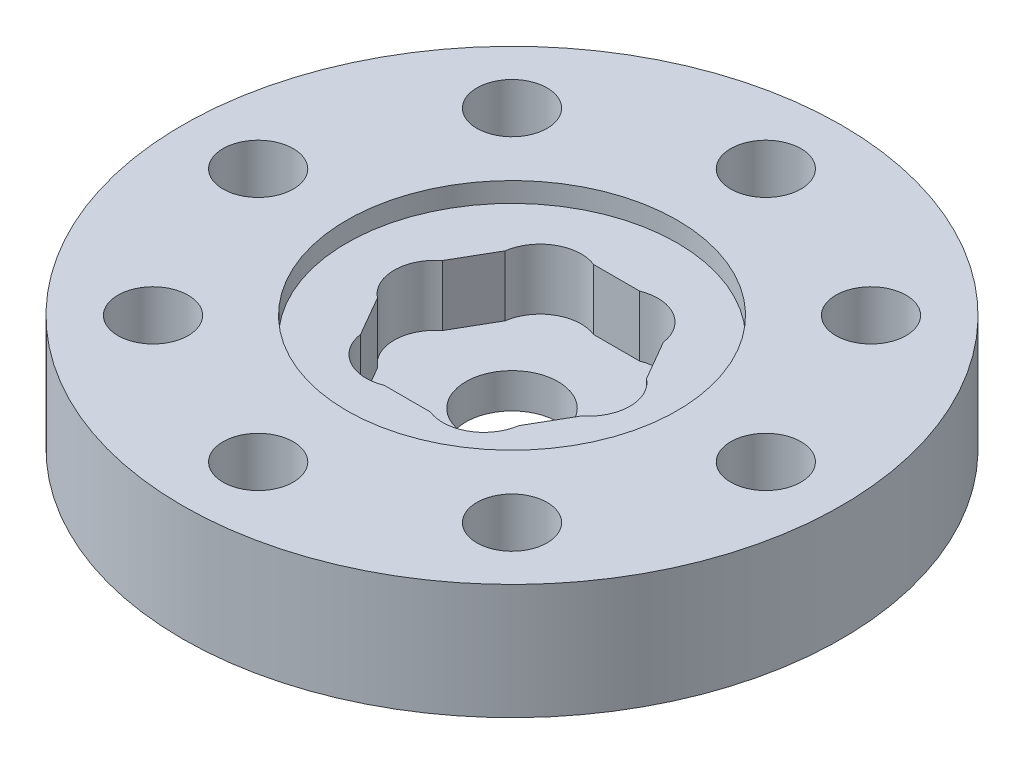
ISO-10303-21;
HEADER;
FILE_DESCRIPTION(('STEP AP214'),'2;1');
FILE_NAME('part.step','',(''),(''),'','','');
FILE_SCHEMA(('AUTOMOTIVE_DESIGN { 1 0 10303 214 1 1 1 1 }'));
ENDSEC;
DATA;
#1=APPLICATION_CONTEXT('core data for automotive mechanical design processes');
#2=APPLICATION_PROTOCOL_DEFINITION('international standard','automotive_design',2000,#1);
#3=PRODUCT_CONTEXT('',#1,'mechanical');
#4=PRODUCT('Part','Part','',(#3));
#5=PRODUCT_RELATED_PRODUCT_CATEGORY('part','',(#4));
#6=PRODUCT_DEFINITION_FORMATION('','',#4);
#7=PRODUCT_DEFINITION_CONTEXT('part definition',#1,'design');
#8=PRODUCT_DEFINITION('design','',#6,#7);
#9=PRODUCT_DEFINITION_SHAPE('','',#8);
#10=(LENGTH_UNIT() NAMED_UNIT(*) SI_UNIT(.MILLI.,.METRE.));
#11=(NAMED_UNIT(*) PLANE_ANGLE_UNIT() SI_UNIT($,.RADIAN.));
#12=(NAMED_UNIT(*) SI_UNIT($,.STERADIAN.) SOLID_ANGLE_UNIT());
#13=UNCERTAINTY_MEASURE_WITH_UNIT(LENGTH_MEASURE(1.E-05),#10,'distance_accuracy_value','');
#14=(GEOMETRIC_REPRESENTATION_CONTEXT(3) GLOBAL_UNCERTAINTY_ASSIGNED_CONTEXT((#13)) GLOBAL_UNIT_ASSIGNED_CONTEXT((#10,
#11,#12)) REPRESENTATION_CONTEXT('',''));
#15=CARTESIAN_POINT('',(0.,0.,0.));
#16=DIRECTION('',(0.,0.,1.));
#17=DIRECTION('',(1.,0.,0.));
#18=AXIS2_PLACEMENT_3D('',#15,#16,#17);
#19=CARTESIAN_POINT('',(0.,0.,0.));
#20=DIRECTION('',(0.,1.,0.));
#21=DIRECTION('',(0.,0.,1.));
#22=AXIS2_PLACEMENT_3D('',#19,#20,#21);
#23=PLANE('',#22);
#24=CARTESIAN_POINT('',(0.,5.21913241791072E-11,0.));
#25=DIRECTION('',(0.,1.,0.));
#26=DIRECTION('',(0.,0.,1.));
#27=AXIS2_PLACEMENT_3D('',#24,#25,#26);
#28=CIRCLE('',#27,4.12749999998141);
#29=CARTESIAN_POINT('',(0.,5.21913241791072E-11,4.12749999998141));
#30=VERTEX_POINT('',#29);
#31=EDGE_CURVE('E269',#30,#30,#28,.T.);
#32=ORIENTED_EDGE('',*,*,#31,.F.);
#33=EDGE_LOOP('',(#32));
#34=FACE_BOUND('',#33,.T.);
#35=CARTESIAN_POINT('',(0.,0.,0.));
#36=DIRECTION('',(0.,1.,0.));
#37=DIRECTION('',(0.,0.,1.));
#38=AXIS2_PLACEMENT_3D('',#35,#36,#37);
#39=CIRCLE('',#38,1.77799999999999);
#40=CARTESIAN_POINT('',(0.,0.,1.77799999999999));
#41=VERTEX_POINT('',#40);
#42=EDGE_CURVE('E19',#41,#41,#39,.T.);
#43=ORIENTED_EDGE('',*,*,#42,.T.);
#44=EDGE_LOOP('',(#43));
#45=FACE_BOUND('',#44,.T.);
#46=ADVANCED_FACE('F16',(#34,#45),#23,.F.);
#47=CARTESIAN_POINT('',(0.,1.3462,0.));
#48=DIRECTION('',(0.,1.,0.));
#49=DIRECTION('',(0.,0.,1.));
#50=AXIS2_PLACEMENT_3D('',#47,#48,#49);
#51=CYLINDRICAL_SURFACE('',#50,1.77799999999999);
#52=CARTESIAN_POINT('',(0.,1.3462,0.));
#53=DIRECTION('',(0.,1.,0.));
#54=DIRECTION('',(0.,0.,1.));
#55=AXIS2_PLACEMENT_3D('',#52,#53,#54);
#56=CIRCLE('',#55,1.77799999999999);
#57=CARTESIAN_POINT('',(0.,1.3462,1.77799999999999));
#58=VERTEX_POINT('',#57);
#59=EDGE_CURVE('E267',#58,#58,#56,.F.);
#60=ORIENTED_EDGE('',*,*,#59,.F.);
#61=EDGE_LOOP('',(#60));
#62=FACE_BOUND('',#61,.T.);
#63=ORIENTED_EDGE('',*,*,#42,.F.);
#64=EDGE_LOOP('',(#63));
#65=FACE_BOUND('',#64,.T.);
#66=ADVANCED_FACE('F277',(#62,#65),#51,.F.);
#67=CARTESIAN_POINT('',(0.,1.21919999997999,0.));
#68=DIRECTION('',(0.,1.,0.));
#69=DIRECTION('',(0.,0.,1.));
#70=AXIS2_PLACEMENT_3D('',#67,#68,#69);
#71=CONICAL_SURFACE('',#70,5.39871959597349,0.806283010546046);
#72=ORIENTED_EDGE('',*,*,#31,.T.);
#73=EDGE_LOOP('',(#72));
#74=FACE_BOUND('',#73,.T.);
#75=CARTESIAN_POINT('',(0.,1.21920000008903,0.));
#76=DIRECTION('',(0.,1.,0.));
#77=DIRECTION('',(0.,0.,1.));
#78=AXIS2_PLACEMENT_3D('',#75,#76,#77);
#79=CIRCLE('',#78,5.39871959608718);
#80=CARTESIAN_POINT('',(0.,1.21920000008903,5.39871959608718));
#81=VERTEX_POINT('',#80);
#82=EDGE_CURVE('E183',#81,#81,#79,.T.);
#83=ORIENTED_EDGE('',*,*,#82,.F.);
#84=EDGE_LOOP('',(#83));
#85=FACE_BOUND('',#84,.T.);
#86=ADVANCED_FACE('F279',(#74,#85),#71,.T.);
#87=CARTESIAN_POINT('',(0.,1.3462,0.));
#88=DIRECTION('',(0.,1.,0.));
#89=DIRECTION('',(0.,0.,1.));
#90=AXIS2_PLACEMENT_3D('',#87,#88,#89);
#91=PLANE('',#90);
#92=DIRECTION('',(-0.5,0.,-0.866025403784439));
#93=VECTOR('',#92,1.);
#94=CARTESIAN_POINT('',(3.4920309344098,1.3462,-2.016125));
#95=LINE('',#94,#93);
#96=CARTESIAN_POINT('',(3.93473684008889,1.3462,-1.24933587855304));
#97=VERTEX_POINT('',#96);
#98=CARTESIAN_POINT('',(3.04932502873073,1.3462,-2.78291412144695));
#99=VERTEX_POINT('',#98);
#100=EDGE_CURVE('E176',#97,#99,#95,.T.);
#101=ORIENTED_EDGE('',*,*,#100,.T.);
#102=CARTESIAN_POINT('',(1.477645,1.3462,-2.55935621555012));
#103=DIRECTION('',(0.,1.,0.));
#104=DIRECTION('',(0.,0.,1.));
#105=AXIS2_PLACEMENT_3D('',#102,#103,#104);
#106=CIRCLE('',#105,1.5875);
#107=CARTESIAN_POINT('',(0.885411811358147,1.3462,-4.03225));
#108=VERTEX_POINT('',#107);
#109=EDGE_CURVE('E179',#99,#108,#106,.T.);
#110=ORIENTED_EDGE('',*,*,#109,.T.);
#111=DIRECTION('',(-1.,0.,0.));
#112=VECTOR('',#111,1.);
#113=CARTESIAN_POINT('',(0.,1.3462,-4.03225));
#114=LINE('',#113,#112);
#115=CARTESIAN_POINT('',(-0.885411811358071,1.3462,-4.03225));
#116=VERTEX_POINT('',#115);
#117=EDGE_CURVE('E181',#108,#116,#114,.T.);
#118=ORIENTED_EDGE('',*,*,#117,.T.);
#119=CARTESIAN_POINT('',(-1.47764499999997,1.3462,-2.55935621555013));
#120=DIRECTION('',(0.,1.,0.));
#121=DIRECTION('',(0.,0.,1.));
#122=AXIS2_PLACEMENT_3D('',#119,#120,#121);
#123=CIRCLE('',#122,1.5875);
#124=CARTESIAN_POINT('',(-3.04932502873069,1.3462,-2.78291412144701));
#125=VERTEX_POINT('',#124);
#126=EDGE_CURVE('E152',#116,#125,#123,.T.);
#127=ORIENTED_EDGE('',*,*,#126,.T.);
#128=DIRECTION('',(-0.5,0.,0.866025403784439));
#129=VECTOR('',#128,1.);
#130=CARTESIAN_POINT('',(-3.4920309344098,1.3462,-2.016125));
#131=LINE('',#130,#129);
#132=CARTESIAN_POINT('',(-3.93473684008885,1.3462,-1.2493358785531));
#133=VERTEX_POINT('',#132);
#134=EDGE_CURVE('E158',#125,#133,#131,.T.);
#135=ORIENTED_EDGE('',*,*,#134,.T.);
#136=CARTESIAN_POINT('',(-2.95529,1.3462,0.));
#137=DIRECTION('',(0.,1.,0.));
#138=DIRECTION('',(0.,0.,1.));
#139=AXIS2_PLACEMENT_3D('',#136,#137,#138);
#140=CIRCLE('',#139,1.5875);
#141=CARTESIAN_POINT('',(-3.9347368400889,1.3462,1.249335878553));
#142=VERTEX_POINT('',#141);
#143=EDGE_CURVE('E161',#133,#142,#140,.T.);
#144=ORIENTED_EDGE('',*,*,#143,.T.);
#145=DIRECTION('',(0.500000000000001,0.,0.866025403784438));
#146=VECTOR('',#145,1.);
#147=CARTESIAN_POINT('',(-3.4920309344098,1.3462,2.016125));
#148=LINE('',#147,#146);
#149=CARTESIAN_POINT('',(-3.04932502873075,1.3462,2.78291412144691));
#150=VERTEX_POINT('',#149);
#151=EDGE_CURVE('E163',#142,#150,#148,.T.);
#152=ORIENTED_EDGE('',*,*,#151,.T.);
#153=CARTESIAN_POINT('',(-1.47764500000002,1.3462,2.55935621555011));
#154=DIRECTION('',(0.,1.,0.));
#155=DIRECTION('',(0.,0.,1.));
#156=AXIS2_PLACEMENT_3D('',#153,#154,#155);
#157=CIRCLE('',#156,1.5875);
#158=CARTESIAN_POINT('',(-0.885411811358191,1.3462,4.03225));
#159=VERTEX_POINT('',#158);
#160=EDGE_CURVE('E130',#150,#159,#157,.T.);
#161=ORIENTED_EDGE('',*,*,#160,.T.);
#162=DIRECTION('',(1.,0.,0.));
#163=VECTOR('',#162,1.);
#164=CARTESIAN_POINT('',(0.,1.3462,4.03225));
#165=LINE('',#164,#163);
#166=CARTESIAN_POINT('',(0.88541181135812,1.3462,4.03225));
#167=VERTEX_POINT('',#166);
#168=EDGE_CURVE('E131',#159,#167,#165,.T.);
#169=ORIENTED_EDGE('',*,*,#168,.T.);
#170=CARTESIAN_POINT('',(1.47764499999999,1.3462,2.55935621555012));
#171=DIRECTION('',(0.,1.,0.));
#172=DIRECTION('',(0.,0.,1.));
#173=AXIS2_PLACEMENT_3D('',#170,#171,#172);
#174=CIRCLE('',#173,1.5875);
#175=CARTESIAN_POINT('',(3.04932502873072,1.3462,2.78291412144697));
#176=VERTEX_POINT('',#175);
#177=EDGE_CURVE('E126',#167,#176,#174,.T.);
#178=ORIENTED_EDGE('',*,*,#177,.T.);
#179=DIRECTION('',(0.5,0.,-0.866025403784439));
#180=VECTOR('',#179,1.);
#181=CARTESIAN_POINT('',(3.4920309344098,1.3462,2.016125));
#182=LINE('',#181,#180);
#183=CARTESIAN_POINT('',(3.93473684008887,1.3462,1.24933587855306));
#184=VERTEX_POINT('',#183);
#185=EDGE_CURVE('E170',#176,#184,#182,.T.);
#186=ORIENTED_EDGE('',*,*,#185,.T.);
#187=CARTESIAN_POINT('',(2.95529,1.3462,0.));
#188=DIRECTION('',(0.,1.,0.));
#189=DIRECTION('',(0.,0.,1.));
#190=AXIS2_PLACEMENT_3D('',#187,#188,#189);
#191=CIRCLE('',#190,1.5875);
#192=EDGE_CURVE('E173',#184,#97,#191,.T.);
#193=ORIENTED_EDGE('',*,*,#192,.T.);
#194=EDGE_LOOP('',(#101,#110,#118,#127,#135,#144,#152,#161,#169,#178,#186,#193));
#195=FACE_BOUND('',#194,.T.);
#196=ORIENTED_EDGE('',*,*,#59,.T.);
#197=EDGE_LOOP('',(#196));
#198=FACE_BOUND('',#197,.T.);
#199=ADVANCED_FACE('F286',(#195,#198),#91,.T.);
#200=CARTESIAN_POINT('',(0.,1.2192,0.));
#201=DIRECTION('',(0.,-1.,0.));
#202=DIRECTION('',(0.,0.,-1.));
#203=AXIS2_PLACEMENT_3D('',#200,#201,#202);
#204=PLANE('',#203);
#205=CARTESIAN_POINT('',(0.,1.2192,0.));
#206=DIRECTION('',(0.,-1.,0.));
#207=DIRECTION('',(0.,0.,-1.));
#208=AXIS2_PLACEMENT_3D('',#205,#206,#207);
#209=CIRCLE('',#208,6.67517040391699);
#210=CARTESIAN_POINT('',(0.,1.2192,-6.67517040391699));
#211=VERTEX_POINT('',#210);
#212=EDGE_CURVE('E150',#211,#211,#209,.T.);
#213=ORIENTED_EDGE('',*,*,#212,.T.);
#214=EDGE_LOOP('',(#213));
#215=FACE_BOUND('',#214,.T.);
#216=ORIENTED_EDGE('',*,*,#82,.T.);
#217=EDGE_LOOP('',(#216));
#218=FACE_BOUND('',#217,.T.);
#219=ADVANCED_FACE('F390',(#215,#218),#204,.T.);
#220=CARTESIAN_POINT('',(0.,1.3462,-4.03225));
#221=DIRECTION('',(0.,0.,-1.));
#222=DIRECTION('',(-1.,0.,0.));
#223=AXIS2_PLACEMENT_3D('',#220,#221,#222);
#224=PLANE('',#223);
#225=DIRECTION('',(0.,1.,0.));
#226=VECTOR('',#225,1.);
#227=CARTESIAN_POINT('',(-0.885411811358071,1.3462,-4.03225));
#228=LINE('',#227,#226);
#229=CARTESIAN_POINT('',(-0.885411811358071,3.683,-4.03225));
#230=VERTEX_POINT('',#229);
#231=EDGE_CURVE('E153',#230,#116,#228,.F.);
#232=ORIENTED_EDGE('',*,*,#231,.T.);
#233=ORIENTED_EDGE('',*,*,#117,.F.);
#234=DIRECTION('',(0.,1.,0.));
#235=VECTOR('',#234,1.);
#236=CARTESIAN_POINT('',(0.885411811358147,1.3462,-4.03225));
#237=LINE('',#236,#235);
#238=CARTESIAN_POINT('',(0.885411811358147,3.683,-4.03225));
#239=VERTEX_POINT('',#238);
#240=EDGE_CURVE('E177',#108,#239,#237,.T.);
#241=ORIENTED_EDGE('',*,*,#240,.T.);
#242=DIRECTION('',(1.,0.,0.));
#243=VECTOR('',#242,1.);
#244=CARTESIAN_POINT('',(0.,3.683,-4.03225));
#245=LINE('',#244,#243);
#246=EDGE_CURVE('E147',#230,#239,#245,.T.);
#247=ORIENTED_EDGE('',*,*,#246,.F.);
#248=EDGE_LOOP('',(#232,#233,#241,#247));
#249=FACE_BOUND('',#248,.T.);
#250=ADVANCED_FACE('F386',(#249),#224,.F.);
#251=CARTESIAN_POINT('',(1.477645,1.3462,-2.55935621555012));
#252=DIRECTION('',(0.,1.,0.));
#253=DIRECTION('',(0.,0.,1.));
#254=AXIS2_PLACEMENT_3D('',#251,#252,#253);
#255=CYLINDRICAL_SURFACE('',#254,1.5875);
#256=ORIENTED_EDGE('',*,*,#240,.F.);
#257=ORIENTED_EDGE('',*,*,#109,.F.);
#258=DIRECTION('',(0.,1.,0.));
#259=VECTOR('',#258,1.);
#260=CARTESIAN_POINT('',(3.04932502873073,1.3462,-2.78291412144695));
#261=LINE('',#260,#259);
#262=CARTESIAN_POINT('',(3.04932502873073,3.683,-2.78291412144695));
#263=VERTEX_POINT('',#262);
#264=EDGE_CURVE('E174',#99,#263,#261,.T.);
#265=ORIENTED_EDGE('',*,*,#264,.T.);
#266=CARTESIAN_POINT('',(1.477645,3.683,-2.55935621555012));
#267=DIRECTION('',(0.,1.,0.));
#268=DIRECTION('',(0.,0.,1.));
#269=AXIS2_PLACEMENT_3D('',#266,#267,#268);
#270=CIRCLE('',#269,1.5875);
#271=EDGE_CURVE('E146',#239,#263,#270,.F.);
#272=ORIENTED_EDGE('',*,*,#271,.F.);
#273=EDGE_LOOP('',(#256,#257,#265,#272));
#274=FACE_BOUND('',#273,.T.);
#275=ADVANCED_FACE('F382',(#274),#255,.F.);
#276=CARTESIAN_POINT('',(3.4920309344098,1.3462,-2.016125));
#277=DIRECTION('',(0.866025403784439,0.,-0.5));
#278=DIRECTION('',(-0.5,0.,-0.866025403784439));
#279=AXIS2_PLACEMENT_3D('',#276,#277,#278);
#280=PLANE('',#279);
#281=ORIENTED_EDGE('',*,*,#264,.F.);
#282=ORIENTED_EDGE('',*,*,#100,.F.);
#283=DIRECTION('',(0.,1.,0.));
#284=VECTOR('',#283,1.);
#285=CARTESIAN_POINT('',(3.93473684008889,1.3462,-1.24933587855304));
#286=LINE('',#285,#284);
#287=CARTESIAN_POINT('',(3.93473684008889,3.683,-1.24933587855304));
#288=VERTEX_POINT('',#287);
#289=EDGE_CURVE('E171',#97,#288,#286,.T.);
#290=ORIENTED_EDGE('',*,*,#289,.T.);
#291=DIRECTION('',(0.5,0.,0.866025403784438));
#292=VECTOR('',#291,1.);
#293=CARTESIAN_POINT('',(3.04932502873073,3.683,-2.78291412144695));
#294=LINE('',#293,#292);
#295=EDGE_CURVE('E143',#263,#288,#294,.T.);
#296=ORIENTED_EDGE('',*,*,#295,.F.);
#297=EDGE_LOOP('',(#281,#282,#290,#296));
#298=FACE_BOUND('',#297,.T.);
#299=ADVANCED_FACE('F378',(#298),#280,.F.);
#300=CARTESIAN_POINT('',(2.95529,1.3462,0.));
#301=DIRECTION('',(0.,1.,0.));
#302=DIRECTION('',(0.,0.,1.));
#303=AXIS2_PLACEMENT_3D('',#300,#301,#302);
#304=CYLINDRICAL_SURFACE('',#303,1.5875);
#305=ORIENTED_EDGE('',*,*,#289,.F.);
#306=ORIENTED_EDGE('',*,*,#192,.F.);
#307=DIRECTION('',(0.,1.,0.));
#308=VECTOR('',#307,1.);
#309=CARTESIAN_POINT('',(3.93473684008887,1.3462,1.24933587855306));
#310=LINE('',#309,#308);
#311=CARTESIAN_POINT('',(3.93473684008887,3.683,1.24933587855306));
#312=VERTEX_POINT('',#311);
#313=EDGE_CURVE('E168',#184,#312,#310,.T.);
#314=ORIENTED_EDGE('',*,*,#313,.T.);
#315=CARTESIAN_POINT('',(2.95529,3.683,0.));
#316=DIRECTION('',(0.,1.,0.));
#317=DIRECTION('',(0.,0.,1.));
#318=AXIS2_PLACEMENT_3D('',#315,#316,#317);
#319=CIRCLE('',#318,1.5875);
#320=EDGE_CURVE('E142',#288,#312,#319,.F.);
#321=ORIENTED_EDGE('',*,*,#320,.F.);
#322=EDGE_LOOP('',(#305,#306,#314,#321));
#323=FACE_BOUND('',#322,.T.);
#324=ADVANCED_FACE('F374',(#323),#304,.F.);
#325=CARTESIAN_POINT('',(3.4920309344098,1.3462,2.016125));
#326=DIRECTION('',(0.866025403784439,0.,0.5));
#327=DIRECTION('',(0.5,0.,-0.866025403784439));
#328=AXIS2_PLACEMENT_3D('',#325,#326,#327);
#329=PLANE('',#328);
#330=ORIENTED_EDGE('',*,*,#313,.F.);
#331=ORIENTED_EDGE('',*,*,#185,.F.);
#332=DIRECTION('',(0.,1.,0.));
#333=VECTOR('',#332,1.);
#334=CARTESIAN_POINT('',(3.04932502873072,1.3462,2.78291412144697));
#335=LINE('',#334,#333);
#336=CARTESIAN_POINT('',(3.04932502873072,3.683,2.78291412144697));
#337=VERTEX_POINT('',#336);
#338=EDGE_CURVE('E166',#176,#337,#335,.T.);
#339=ORIENTED_EDGE('',*,*,#338,.T.);
#340=DIRECTION('',(-0.5,0.,0.866025403784439));
#341=VECTOR('',#340,1.);
#342=CARTESIAN_POINT('',(3.93473684008887,3.683,1.24933587855306));
#343=LINE('',#342,#341);
#344=EDGE_CURVE('E118',#312,#337,#343,.T.);
#345=ORIENTED_EDGE('',*,*,#344,.F.);
#346=EDGE_LOOP('',(#330,#331,#339,#345));
#347=FACE_BOUND('',#346,.T.);
#348=ADVANCED_FACE('F371',(#347),#329,.F.);
#349=CARTESIAN_POINT('',(1.47764499999999,1.3462,2.55935621555012));
#350=DIRECTION('',(0.,1.,0.));
#351=DIRECTION('',(0.,0.,1.));
#352=AXIS2_PLACEMENT_3D('',#349,#350,#351);
#353=CYLINDRICAL_SURFACE('',#352,1.5875);
#354=ORIENTED_EDGE('',*,*,#177,.F.);
#355=DIRECTION('',(0.,1.,0.));
#356=VECTOR('',#355,1.);
#357=CARTESIAN_POINT('',(0.88541181135812,1.3462,4.03225));
#358=LINE('',#357,#356);
#359=CARTESIAN_POINT('',(0.885411811358121,3.683,4.03225));
#360=VERTEX_POINT('',#359);
#361=EDGE_CURVE('E123',#167,#360,#358,.T.);
#362=ORIENTED_EDGE('',*,*,#361,.T.);
#363=CARTESIAN_POINT('',(1.47764499999999,3.683,2.55935621555012));
#364=DIRECTION('',(0.,1.,0.));
#365=DIRECTION('',(0.,0.,1.));
#366=AXIS2_PLACEMENT_3D('',#363,#364,#365);
#367=CIRCLE('',#366,1.5875);
#368=EDGE_CURVE('E110',#337,#360,#367,.F.);
#369=ORIENTED_EDGE('',*,*,#368,.F.);
#370=ORIENTED_EDGE('',*,*,#338,.F.);
#371=EDGE_LOOP('',(#354,#362,#369,#370));
#372=FACE_BOUND('',#371,.T.);
#373=ADVANCED_FACE('F124',(#372),#353,.F.);
#374=CARTESIAN_POINT('',(0.,1.3462,4.03225));
#375=DIRECTION('',(0.,0.,1.));
#376=DIRECTION('',(1.,0.,0.));
#377=AXIS2_PLACEMENT_3D('',#374,#375,#376);
#378=PLANE('',#377);
#379=ORIENTED_EDGE('',*,*,#361,.F.);
#380=ORIENTED_EDGE('',*,*,#168,.F.);
#381=DIRECTION('',(0.,1.,0.));
#382=VECTOR('',#381,1.);
#383=CARTESIAN_POINT('',(-0.885411811358191,1.3462,4.03225));
#384=LINE('',#383,#382);
#385=CARTESIAN_POINT('',(-0.885411811358191,3.683,4.03225));
#386=VERTEX_POINT('',#385);
#387=EDGE_CURVE('E134',#386,#159,#384,.F.);
#388=ORIENTED_EDGE('',*,*,#387,.F.);
#389=DIRECTION('',(1.,0.,0.));
#390=VECTOR('',#389,1.);
#391=CARTESIAN_POINT('',(0.,3.683,4.03225));
#392=LINE('',#391,#390);
#393=EDGE_CURVE('E115',#360,#386,#392,.F.);
#394=ORIENTED_EDGE('',*,*,#393,.F.);
#395=EDGE_LOOP('',(#379,#380,#388,#394));
#396=FACE_BOUND('',#395,.T.);
#397=ADVANCED_FACE('F133',(#396),#378,.F.);
#398=CARTESIAN_POINT('',(-1.47764500000002,1.3462,2.55935621555011));
#399=DIRECTION('',(0.,1.,0.));
#400=DIRECTION('',(0.,0.,1.));
#401=AXIS2_PLACEMENT_3D('',#398,#399,#400);
#402=CYLINDRICAL_SURFACE('',#401,1.5875);
#403=ORIENTED_EDGE('',*,*,#160,.F.);
#404=DIRECTION('',(0.,1.,0.));
#405=VECTOR('',#404,1.);
#406=CARTESIAN_POINT('',(-3.04932502873075,1.3462,2.78291412144691));
#407=LINE('',#406,#405);
#408=CARTESIAN_POINT('',(-3.04932502873075,3.683,2.78291412144691));
#409=VERTEX_POINT('',#408);
#410=EDGE_CURVE('E162',#150,#409,#407,.T.);
#411=ORIENTED_EDGE('',*,*,#410,.T.);
#412=CARTESIAN_POINT('',(-1.47764500000002,3.683,2.55935621555011));
#413=DIRECTION('',(0.,1.,0.));
#414=DIRECTION('',(0.,0.,1.));
#415=AXIS2_PLACEMENT_3D('',#412,#413,#414);
#416=CIRCLE('',#415,1.5875);
#417=EDGE_CURVE('E103',#386,#409,#416,.F.);
#418=ORIENTED_EDGE('',*,*,#417,.F.);
#419=ORIENTED_EDGE('',*,*,#387,.T.);
#420=EDGE_LOOP('',(#403,#411,#418,#419));
#421=FACE_BOUND('',#420,.T.);
#422=ADVANCED_FACE('F363',(#421),#402,.F.);
#423=CARTESIAN_POINT('',(-3.4920309344098,1.3462,2.016125));
#424=DIRECTION('',(-0.866025403784438,0.,0.500000000000001));
#425=DIRECTION('',(0.500000000000001,0.,0.866025403784438));
#426=AXIS2_PLACEMENT_3D('',#423,#424,#425);
#427=PLANE('',#426);
#428=ORIENTED_EDGE('',*,*,#410,.F.);
#429=ORIENTED_EDGE('',*,*,#151,.F.);
#430=DIRECTION('',(0.,1.,0.));
#431=VECTOR('',#430,1.);
#432=CARTESIAN_POINT('',(-3.93473684008891,1.3462,1.249335878553));
#433=LINE('',#432,#431);
#434=CARTESIAN_POINT('',(-3.9347368400889,3.683,1.249335878553));
#435=VERTEX_POINT('',#434);
#436=EDGE_CURVE('E159',#142,#435,#433,.T.);
#437=ORIENTED_EDGE('',*,*,#436,.T.);
#438=DIRECTION('',(-0.5,0.,-0.866025403784438));
#439=VECTOR('',#438,1.);
#440=CARTESIAN_POINT('',(-3.04932502873075,3.683,2.78291412144691));
#441=LINE('',#440,#439);
#442=EDGE_CURVE('E136',#409,#435,#441,.T.);
#443=ORIENTED_EDGE('',*,*,#442,.F.);
#444=EDGE_LOOP('',(#428,#429,#437,#443));
#445=FACE_BOUND('',#444,.T.);
#446=ADVANCED_FACE('F359',(#445),#427,.F.);
#447=CARTESIAN_POINT('',(-2.95529,1.3462,0.));
#448=DIRECTION('',(0.,1.,0.));
#449=DIRECTION('',(0.,0.,1.));
#450=AXIS2_PLACEMENT_3D('',#447,#448,#449);
#451=CYLINDRICAL_SURFACE('',#450,1.5875);
#452=ORIENTED_EDGE('',*,*,#436,.F.);
#453=ORIENTED_EDGE('',*,*,#143,.F.);
#454=DIRECTION('',(0.,1.,0.));
#455=VECTOR('',#454,1.);
#456=CARTESIAN_POINT('',(-3.93473684008885,1.3462,-1.2493358785531));
#457=LINE('',#456,#455);
#458=CARTESIAN_POINT('',(-3.93473684008885,3.683,-1.2493358785531));
#459=VERTEX_POINT('',#458);
#460=EDGE_CURVE('E156',#133,#459,#457,.T.);
#461=ORIENTED_EDGE('',*,*,#460,.T.);
#462=CARTESIAN_POINT('',(-2.95529,3.683,0.));
#463=DIRECTION('',(0.,1.,0.));
#464=DIRECTION('',(0.,0.,1.));
#465=AXIS2_PLACEMENT_3D('',#462,#463,#464);
#466=CIRCLE('',#465,1.5875);
#467=EDGE_CURVE('E251',#435,#459,#466,.F.);
#468=ORIENTED_EDGE('',*,*,#467,.F.);
#469=EDGE_LOOP('',(#452,#453,#461,#468));
#470=FACE_BOUND('',#469,.T.);
#471=ADVANCED_FACE('F356',(#470),#451,.F.);
#472=CARTESIAN_POINT('',(-3.4920309344098,1.3462,-2.016125));
#473=DIRECTION('',(-0.866025403784439,0.,-0.5));
#474=DIRECTION('',(-0.5,0.,0.866025403784439));
#475=AXIS2_PLACEMENT_3D('',#472,#473,#474);
#476=PLANE('',#475);
#477=ORIENTED_EDGE('',*,*,#460,.F.);
#478=ORIENTED_EDGE('',*,*,#134,.F.);
#479=DIRECTION('',(0.,1.,0.));
#480=VECTOR('',#479,1.);
#481=CARTESIAN_POINT('',(-3.04932502873069,1.3462,-2.78291412144701));
#482=LINE('',#481,#480);
#483=CARTESIAN_POINT('',(-3.04932502873069,3.683,-2.78291412144701));
#484=VERTEX_POINT('',#483);
#485=EDGE_CURVE('E34',#125,#484,#482,.T.);
#486=ORIENTED_EDGE('',*,*,#485,.T.);
#487=DIRECTION('',(0.5,0.,-0.866025403784439));
#488=VECTOR('',#487,1.);
#489=CARTESIAN_POINT('',(-3.93473684008885,3.683,-1.2493358785531));
#490=LINE('',#489,#488);
#491=EDGE_CURVE('E250',#459,#484,#490,.T.);
#492=ORIENTED_EDGE('',*,*,#491,.F.);
#493=EDGE_LOOP('',(#477,#478,#486,#492));
#494=FACE_BOUND('',#493,.T.);
#495=ADVANCED_FACE('F352',(#494),#476,.F.);
#496=CARTESIAN_POINT('',(-1.47764499999997,1.3462,-2.55935621555013));
#497=DIRECTION('',(0.,1.,0.));
#498=DIRECTION('',(0.,0.,1.));
#499=AXIS2_PLACEMENT_3D('',#496,#497,#498);
#500=CYLINDRICAL_SURFACE('',#499,1.5875);
#501=ORIENTED_EDGE('',*,*,#485,.F.);
#502=ORIENTED_EDGE('',*,*,#126,.F.);
#503=ORIENTED_EDGE('',*,*,#231,.F.);
#504=CARTESIAN_POINT('',(-1.47764499999997,3.683,-2.55935621555013));
#505=DIRECTION('',(0.,1.,0.));
#506=DIRECTION('',(0.,0.,1.));
#507=AXIS2_PLACEMENT_3D('',#504,#505,#506);
#508=CIRCLE('',#507,1.5875);
#509=EDGE_CURVE('E247',#484,#230,#508,.F.);
#510=ORIENTED_EDGE('',*,*,#509,.F.);
#511=EDGE_LOOP('',(#501,#502,#503,#510));
#512=FACE_BOUND('',#511,.T.);
#513=ADVANCED_FACE('F348',(#512),#500,.F.);
#514=CARTESIAN_POINT('',(0.,0.,0.));
#515=DIRECTION('',(0.,-1.,0.));
#516=DIRECTION('',(0.,0.,-1.));
#517=AXIS2_PLACEMENT_3D('',#514,#515,#516);
#518=CONICAL_SURFACE('',#517,7.94639,0.806283010552195);
#519=CARTESIAN_POINT('',(0.,0.,0.));
#520=DIRECTION('',(0.,-1.,0.));
#521=DIRECTION('',(0.,0.,-1.));
#522=AXIS2_PLACEMENT_3D('',#519,#520,#521);
#523=CIRCLE('',#522,7.94639);
#524=CARTESIAN_POINT('',(0.,0.,-7.94639));
#525=VERTEX_POINT('',#524);
#526=EDGE_CURVE('E244',#525,#525,#523,.T.);
#527=ORIENTED_EDGE('',*,*,#526,.T.);
#528=EDGE_LOOP('',(#527));
#529=FACE_BOUND('',#528,.T.);
#530=ORIENTED_EDGE('',*,*,#212,.F.);
#531=EDGE_LOOP('',(#530));
#532=FACE_BOUND('',#531,.T.);
#533=ADVANCED_FACE('F344',(#529,#532),#518,.F.);
#534=CARTESIAN_POINT('',(0.,3.683,0.));
#535=DIRECTION('',(0.,1.,0.));
#536=DIRECTION('',(0.,0.,1.));
#537=AXIS2_PLACEMENT_3D('',#534,#535,#536);
#538=PLANE('',#537);
#539=CARTESIAN_POINT('',(0.,3.683,0.));
#540=DIRECTION('',(0.,1.,0.));
#541=DIRECTION('',(0.,0.,1.));
#542=AXIS2_PLACEMENT_3D('',#539,#540,#541);
#543=CIRCLE('',#542,6.3627);
#544=CARTESIAN_POINT('',(0.,3.683,6.3627));
#545=VERTEX_POINT('',#544);
#546=EDGE_CURVE('E217',#545,#545,#543,.T.);
#547=ORIENTED_EDGE('',*,*,#546,.T.);
#548=EDGE_LOOP('',(#547));
#549=FACE_BOUND('',#548,.T.);
#550=ORIENTED_EDGE('',*,*,#491,.T.);
#551=ORIENTED_EDGE('',*,*,#509,.T.);
#552=ORIENTED_EDGE('',*,*,#246,.T.);
#553=ORIENTED_EDGE('',*,*,#271,.T.);
#554=ORIENTED_EDGE('',*,*,#295,.T.);
#555=ORIENTED_EDGE('',*,*,#320,.T.);
#556=ORIENTED_EDGE('',*,*,#344,.T.);
#557=ORIENTED_EDGE('',*,*,#368,.T.);
#558=ORIENTED_EDGE('',*,*,#393,.T.);
#559=ORIENTED_EDGE('',*,*,#417,.T.);
#560=ORIENTED_EDGE('',*,*,#442,.T.);
#561=ORIENTED_EDGE('',*,*,#467,.T.);
#562=EDGE_LOOP('',(#550,#551,#552,#553,#554,#555,#556,#557,#558,#559,#560,#561));
#563=FACE_BOUND('',#562,.T.);
#564=ADVANCED_FACE('F113',(#549,#563),#538,.T.);
#565=CARTESIAN_POINT('',(0.,0.,0.));
#566=DIRECTION('',(0.,1.,0.));
#567=DIRECTION('',(0.,0.,1.));
#568=AXIS2_PLACEMENT_3D('',#565,#566,#567);
#569=PLANE('',#568);
#570=ORIENTED_EDGE('',*,*,#526,.F.);
#571=EDGE_LOOP('',(#570));
#572=FACE_BOUND('',#571,.T.);
#573=CARTESIAN_POINT('',(6.91479721322333,0.,6.91479721322316));
#574=DIRECTION('',(0.,1.,0.));
#575=DIRECTION('',(0.,0.,1.));
#576=AXIS2_PLACEMENT_3D('',#573,#574,#575);
#577=CIRCLE('',#576,1.35255);
#578=CARTESIAN_POINT('',(6.91479721322333,0.,8.26734721322316));
#579=VERTEX_POINT('',#578);
#580=EDGE_CURVE('E241',#579,#579,#577,.T.);
#581=ORIENTED_EDGE('',*,*,#580,.T.);
#582=EDGE_LOOP('',(#581));
#583=FACE_BOUND('',#582,.T.);
#584=CARTESIAN_POINT('',(1.02429588037641E-13,0.,9.779));
#585=DIRECTION('',(0.,1.,0.));
#586=DIRECTION('',(0.,0.,1.));
#587=AXIS2_PLACEMENT_3D('',#584,#585,#586);
#588=CIRCLE('',#587,1.35255);
#589=CARTESIAN_POINT('',(1.02429588037641E-13,0.,11.13155));
#590=VERTEX_POINT('',#589);
#591=EDGE_CURVE('E238',#590,#590,#588,.T.);
#592=ORIENTED_EDGE('',*,*,#591,.T.);
#593=EDGE_LOOP('',(#592));
#594=FACE_BOUND('',#593,.T.);
#595=CARTESIAN_POINT('',(-6.91479721322319,0.,6.91479721322331));
#596=DIRECTION('',(0.,1.,0.));
#597=DIRECTION('',(0.,0.,1.));
#598=AXIS2_PLACEMENT_3D('',#595,#596,#597);
#599=CIRCLE('',#598,1.35255);
#600=CARTESIAN_POINT('',(-6.91479721322319,0.,8.26734721322331));
#601=VERTEX_POINT('',#600);
#602=EDGE_CURVE('E235',#601,#601,#599,.T.);
#603=ORIENTED_EDGE('',*,*,#602,.T.);
#604=EDGE_LOOP('',(#603));
#605=FACE_BOUND('',#604,.T.);
#606=CARTESIAN_POINT('',(-9.779,0.,0.));
#607=DIRECTION('',(0.,1.,0.));
#608=DIRECTION('',(0.,0.,1.));
#609=AXIS2_PLACEMENT_3D('',#606,#607,#608);
#610=CIRCLE('',#609,1.35255);
#611=CARTESIAN_POINT('',(-9.779,0.,1.35255));
#612=VERTEX_POINT('',#611);
#613=EDGE_CURVE('E232',#612,#612,#610,.T.);
#614=ORIENTED_EDGE('',*,*,#613,.T.);
#615=EDGE_LOOP('',(#614));
#616=FACE_BOUND('',#615,.T.);
#617=CARTESIAN_POINT('',(-6.91479721322328,0.,-6.91479721322321));
#618=DIRECTION('',(0.,1.,0.));
#619=DIRECTION('',(0.,0.,1.));
#620=AXIS2_PLACEMENT_3D('',#617,#618,#619);
#621=CIRCLE('',#620,1.35255);
#622=CARTESIAN_POINT('',(-6.91479721322328,0.,-5.56224721322321));
#623=VERTEX_POINT('',#622);
#624=EDGE_CURVE('E229',#623,#623,#621,.T.);
#625=ORIENTED_EDGE('',*,*,#624,.T.);
#626=EDGE_LOOP('',(#625));
#627=FACE_BOUND('',#626,.T.);
#628=CARTESIAN_POINT('',(0.,0.,-9.779));
#629=DIRECTION('',(0.,1.,0.));
#630=DIRECTION('',(0.,0.,1.));
#631=AXIS2_PLACEMENT_3D('',#628,#629,#630);
#632=CIRCLE('',#631,1.35255);
#633=CARTESIAN_POINT('',(0.,0.,-8.42645));
#634=VERTEX_POINT('',#633);
#635=EDGE_CURVE('E226',#634,#634,#632,.T.);
#636=ORIENTED_EDGE('',*,*,#635,.T.);
#637=EDGE_LOOP('',(#636));
#638=FACE_BOUND('',#637,.T.);
#639=CARTESIAN_POINT('',(6.91479721322324,0.,-6.91479721322326));
#640=DIRECTION('',(0.,1.,0.));
#641=DIRECTION('',(0.,0.,1.));
#642=AXIS2_PLACEMENT_3D('',#639,#640,#641);
#643=CIRCLE('',#642,1.35255);
#644=CARTESIAN_POINT('',(6.91479721322324,0.,-5.56224721322326));
#645=VERTEX_POINT('',#644);
#646=EDGE_CURVE('E223',#645,#645,#643,.T.);
#647=ORIENTED_EDGE('',*,*,#646,.T.);
#648=EDGE_LOOP('',(#647));
#649=FACE_BOUND('',#648,.T.);
#650=CARTESIAN_POINT('',(9.779,0.,0.));
#651=DIRECTION('',(0.,1.,0.));
#652=DIRECTION('',(0.,0.,1.));
#653=AXIS2_PLACEMENT_3D('',#650,#651,#652);
#654=CIRCLE('',#653,1.35255);
#655=CARTESIAN_POINT('',(9.779,0.,1.35255));
#656=VERTEX_POINT('',#655);
#657=EDGE_CURVE('E220',#656,#656,#654,.T.);
#658=ORIENTED_EDGE('',*,*,#657,.T.);
#659=EDGE_LOOP('',(#658));
#660=FACE_BOUND('',#659,.T.);
#661=CARTESIAN_POINT('',(0.,0.,0.));
#662=DIRECTION('',(0.,-1.,0.));
#663=DIRECTION('',(0.,0.,-1.));
#664=AXIS2_PLACEMENT_3D('',#661,#662,#663);
#665=CIRCLE('',#664,12.69619);
#666=CARTESIAN_POINT('',(0.,0.,-12.69619));
#667=VERTEX_POINT('',#666);
#668=EDGE_CURVE('E214',#667,#667,#665,.F.);
#669=ORIENTED_EDGE('',*,*,#668,.F.);
#670=EDGE_LOOP('',(#669));
#671=FACE_BOUND('',#670,.T.);
#672=ADVANCED_FACE('F337',(#572,#583,#594,#605,#616,#627,#638,#649,#660,#671),#569,.F.);
#673=CARTESIAN_POINT('',(6.91479721322333,4.445,6.91479721322316));
#674=DIRECTION('',(0.,1.,0.));
#675=DIRECTION('',(0.,0.,1.));
#676=AXIS2_PLACEMENT_3D('',#673,#674,#675);
#677=CYLINDRICAL_SURFACE('',#676,1.35255);
#678=CARTESIAN_POINT('',(6.91479721322333,4.445,6.91479721322316));
#679=DIRECTION('',(0.,1.,0.));
#680=DIRECTION('',(0.,0.,1.));
#681=AXIS2_PLACEMENT_3D('',#678,#679,#680);
#682=CIRCLE('',#681,1.35255);
#683=CARTESIAN_POINT('',(6.91479721322333,4.445,8.26734721322316));
#684=VERTEX_POINT('',#683);
#685=EDGE_CURVE('E211',#684,#684,#682,.F.);
#686=ORIENTED_EDGE('',*,*,#685,.F.);
#687=EDGE_LOOP('',(#686));
#688=FACE_BOUND('',#687,.T.);
#689=ORIENTED_EDGE('',*,*,#580,.F.);
#690=EDGE_LOOP('',(#689));
#691=FACE_BOUND('',#690,.T.);
#692=ADVANCED_FACE('F333',(#688,#691),#677,.F.);
#693=CARTESIAN_POINT('',(1.02429588037641E-13,4.445,9.779));
#694=DIRECTION('',(0.,1.,0.));
#695=DIRECTION('',(0.,0.,1.));
#696=AXIS2_PLACEMENT_3D('',#693,#694,#695);
#697=CYLINDRICAL_SURFACE('',#696,1.35255);
#698=CARTESIAN_POINT('',(1.02429588037641E-13,4.445,9.779));
#699=DIRECTION('',(0.,1.,0.));
#700=DIRECTION('',(0.,0.,1.));
#701=AXIS2_PLACEMENT_3D('',#698,#699,#700);
#702=CIRCLE('',#701,1.35255);
#703=CARTESIAN_POINT('',(1.02429588037641E-13,4.445,11.13155));
#704=VERTEX_POINT('',#703);
#705=EDGE_CURVE('E208',#704,#704,#702,.F.);
#706=ORIENTED_EDGE('',*,*,#705,.F.);
#707=EDGE_LOOP('',(#706));
#708=FACE_BOUND('',#707,.T.);
#709=ORIENTED_EDGE('',*,*,#591,.F.);
#710=EDGE_LOOP('',(#709));
#711=FACE_BOUND('',#710,.T.);
#712=ADVANCED_FACE('F329',(#708,#711),#697,.F.);
#713=CARTESIAN_POINT('',(-6.91479721322319,4.445,6.91479721322331));
#714=DIRECTION('',(0.,1.,0.));
#715=DIRECTION('',(0.,0.,1.));
#716=AXIS2_PLACEMENT_3D('',#713,#714,#715);
#717=CYLINDRICAL_SURFACE('',#716,1.35255);
#718=CARTESIAN_POINT('',(-6.91479721322319,4.445,6.91479721322331));
#719=DIRECTION('',(0.,1.,0.));
#720=DIRECTION('',(0.,0.,1.));
#721=AXIS2_PLACEMENT_3D('',#718,#719,#720);
#722=CIRCLE('',#721,1.35255);
#723=CARTESIAN_POINT('',(-6.91479721322319,4.445,8.26734721322331));
#724=VERTEX_POINT('',#723);
#725=EDGE_CURVE('E205',#724,#724,#722,.F.);
#726=ORIENTED_EDGE('',*,*,#725,.F.);
#727=EDGE_LOOP('',(#726));
#728=FACE_BOUND('',#727,.T.);
#729=ORIENTED_EDGE('',*,*,#602,.F.);
#730=EDGE_LOOP('',(#729));
#731=FACE_BOUND('',#730,.T.);
#732=ADVANCED_FACE('F325',(#728,#731),#717,.F.);
#733=CARTESIAN_POINT('',(-9.779,4.445,0.));
#734=DIRECTION('',(0.,1.,0.));
#735=DIRECTION('',(0.,0.,1.));
#736=AXIS2_PLACEMENT_3D('',#733,#734,#735);
#737=CYLINDRICAL_SURFACE('',#736,1.35255);
#738=CARTESIAN_POINT('',(-9.779,4.445,0.));
#739=DIRECTION('',(0.,1.,0.));
#740=DIRECTION('',(0.,0.,1.));
#741=AXIS2_PLACEMENT_3D('',#738,#739,#740);
#742=CIRCLE('',#741,1.35255);
#743=CARTESIAN_POINT('',(-9.779,4.445,1.35255));
#744=VERTEX_POINT('',#743);
#745=EDGE_CURVE('E202',#744,#744,#742,.F.);
#746=ORIENTED_EDGE('',*,*,#745,.F.);
#747=EDGE_LOOP('',(#746));
#748=FACE_BOUND('',#747,.T.);
#749=ORIENTED_EDGE('',*,*,#613,.F.);
#750=EDGE_LOOP('',(#749));
#751=FACE_BOUND('',#750,.T.);
#752=ADVANCED_FACE('F321',(#748,#751),#737,.F.);
#753=CARTESIAN_POINT('',(-6.91479721322328,4.445,-6.91479721322321));
#754=DIRECTION('',(0.,1.,0.));
#755=DIRECTION('',(0.,0.,1.));
#756=AXIS2_PLACEMENT_3D('',#753,#754,#755);
#757=CYLINDRICAL_SURFACE('',#756,1.35255);
#758=CARTESIAN_POINT('',(-6.91479721322328,4.445,-6.91479721322321));
#759=DIRECTION('',(0.,1.,0.));
#760=DIRECTION('',(0.,0.,1.));
#761=AXIS2_PLACEMENT_3D('',#758,#759,#760);
#762=CIRCLE('',#761,1.35255);
#763=CARTESIAN_POINT('',(-6.91479721322328,4.445,-5.56224721322321));
#764=VERTEX_POINT('',#763);
#765=EDGE_CURVE('E199',#764,#764,#762,.F.);
#766=ORIENTED_EDGE('',*,*,#765,.F.);
#767=EDGE_LOOP('',(#766));
#768=FACE_BOUND('',#767,.T.);
#769=ORIENTED_EDGE('',*,*,#624,.F.);
#770=EDGE_LOOP('',(#769));
#771=FACE_BOUND('',#770,.T.);
#772=ADVANCED_FACE('F317',(#768,#771),#757,.F.);
#773=CARTESIAN_POINT('',(0.,4.445,-9.779));
#774=DIRECTION('',(0.,1.,0.));
#775=DIRECTION('',(0.,0.,1.));
#776=AXIS2_PLACEMENT_3D('',#773,#774,#775);
#777=CYLINDRICAL_SURFACE('',#776,1.35255);
#778=CARTESIAN_POINT('',(0.,4.445,-9.779));
#779=DIRECTION('',(0.,1.,0.));
#780=DIRECTION('',(0.,0.,1.));
#781=AXIS2_PLACEMENT_3D('',#778,#779,#780);
#782=CIRCLE('',#781,1.35255);
#783=CARTESIAN_POINT('',(0.,4.445,-8.42645));
#784=VERTEX_POINT('',#783);
#785=EDGE_CURVE('E196',#784,#784,#782,.F.);
#786=ORIENTED_EDGE('',*,*,#785,.F.);
#787=EDGE_LOOP('',(#786));
#788=FACE_BOUND('',#787,.T.);
#789=ORIENTED_EDGE('',*,*,#635,.F.);
#790=EDGE_LOOP('',(#789));
#791=FACE_BOUND('',#790,.T.);
#792=ADVANCED_FACE('F313',(#788,#791),#777,.F.);
#793=CARTESIAN_POINT('',(6.91479721322324,4.445,-6.91479721322326));
#794=DIRECTION('',(0.,1.,0.));
#795=DIRECTION('',(0.,0.,1.));
#796=AXIS2_PLACEMENT_3D('',#793,#794,#795);
#797=CYLINDRICAL_SURFACE('',#796,1.35255);
#798=CARTESIAN_POINT('',(6.91479721322324,4.445,-6.91479721322326));
#799=DIRECTION('',(0.,1.,0.));
#800=DIRECTION('',(0.,0.,1.));
#801=AXIS2_PLACEMENT_3D('',#798,#799,#800);
#802=CIRCLE('',#801,1.35255);
#803=CARTESIAN_POINT('',(6.91479721322324,4.445,-5.56224721322326));
#804=VERTEX_POINT('',#803);
#805=EDGE_CURVE('E193',#804,#804,#802,.F.);
#806=ORIENTED_EDGE('',*,*,#805,.F.);
#807=EDGE_LOOP('',(#806));
#808=FACE_BOUND('',#807,.T.);
#809=ORIENTED_EDGE('',*,*,#646,.F.);
#810=EDGE_LOOP('',(#809));
#811=FACE_BOUND('',#810,.T.);
#812=ADVANCED_FACE('F309',(#808,#811),#797,.F.);
#813=CARTESIAN_POINT('',(9.779,4.445,0.));
#814=DIRECTION('',(0.,1.,0.));
#815=DIRECTION('',(0.,0.,1.));
#816=AXIS2_PLACEMENT_3D('',#813,#814,#815);
#817=CYLINDRICAL_SURFACE('',#816,1.35255);
#818=CARTESIAN_POINT('',(9.779,4.445,0.));
#819=DIRECTION('',(0.,1.,0.));
#820=DIRECTION('',(0.,0.,1.));
#821=AXIS2_PLACEMENT_3D('',#818,#819,#820);
#822=CIRCLE('',#821,1.35255);
#823=CARTESIAN_POINT('',(9.779,4.445,1.35255));
#824=VERTEX_POINT('',#823);
#825=EDGE_CURVE('E190',#824,#824,#822,.F.);
#826=ORIENTED_EDGE('',*,*,#825,.F.);
#827=EDGE_LOOP('',(#826));
#828=FACE_BOUND('',#827,.T.);
#829=ORIENTED_EDGE('',*,*,#657,.F.);
#830=EDGE_LOOP('',(#829));
#831=FACE_BOUND('',#830,.T.);
#832=ADVANCED_FACE('F305',(#828,#831),#817,.F.);
#833=CARTESIAN_POINT('',(0.,3.683,0.));
#834=DIRECTION('',(0.,1.,0.));
#835=DIRECTION('',(0.,0.,1.));
#836=AXIS2_PLACEMENT_3D('',#833,#834,#835);
#837=CYLINDRICAL_SURFACE('',#836,6.3627);
#838=CARTESIAN_POINT('',(0.,4.445,0.));
#839=DIRECTION('',(0.,1.,0.));
#840=DIRECTION('',(0.,0.,1.));
#841=AXIS2_PLACEMENT_3D('',#838,#839,#840);
#842=CIRCLE('',#841,6.3627);
#843=CARTESIAN_POINT('',(0.,4.445,6.3627));
#844=VERTEX_POINT('',#843);
#845=EDGE_CURVE('E25',#844,#844,#842,.F.);
#846=ORIENTED_EDGE('',*,*,#845,.F.);
#847=EDGE_LOOP('',(#846));
#848=FACE_BOUND('',#847,.T.);
#849=ORIENTED_EDGE('',*,*,#546,.F.);
#850=EDGE_LOOP('',(#849));
#851=FACE_BOUND('',#850,.T.);
#852=ADVANCED_FACE('F298',(#848,#851),#837,.F.);
#853=CARTESIAN_POINT('',(0.,4.445,0.));
#854=DIRECTION('',(0.,-1.,0.));
#855=DIRECTION('',(0.,0.,-1.));
#856=AXIS2_PLACEMENT_3D('',#853,#854,#855);
#857=CYLINDRICAL_SURFACE('',#856,12.69619);
#858=ORIENTED_EDGE('',*,*,#668,.T.);
#859=EDGE_LOOP('',(#858));
#860=FACE_BOUND('',#859,.T.);
#861=CARTESIAN_POINT('',(0.,4.445,0.));
#862=DIRECTION('',(0.,-1.,0.));
#863=DIRECTION('',(0.,0.,-1.));
#864=AXIS2_PLACEMENT_3D('',#861,#862,#863);
#865=CIRCLE('',#864,12.69619);
#866=CARTESIAN_POINT('',(0.,4.445,-12.69619));
#867=VERTEX_POINT('',#866);
#868=EDGE_CURVE('E10',#867,#867,#865,.F.);
#869=ORIENTED_EDGE('',*,*,#868,.F.);
#870=EDGE_LOOP('',(#869));
#871=FACE_BOUND('',#870,.T.);
#872=ADVANCED_FACE('F292',(#860,#871),#857,.T.);
#873=CARTESIAN_POINT('',(0.,4.445,0.));
#874=DIRECTION('',(0.,1.,0.));
#875=DIRECTION('',(0.,0.,1.));
#876=AXIS2_PLACEMENT_3D('',#873,#874,#875);
#877=PLANE('',#876);
#878=ORIENTED_EDGE('',*,*,#868,.T.);
#879=EDGE_LOOP('',(#878));
#880=FACE_BOUND('',#879,.T.);
#881=ORIENTED_EDGE('',*,*,#845,.T.);
#882=EDGE_LOOP('',(#881));
#883=FACE_BOUND('',#882,.T.);
#884=ORIENTED_EDGE('',*,*,#825,.T.);
#885=EDGE_LOOP('',(#884));
#886=FACE_BOUND('',#885,.T.);
#887=ORIENTED_EDGE('',*,*,#805,.T.);
#888=EDGE_LOOP('',(#887));
#889=FACE_BOUND('',#888,.T.);
#890=ORIENTED_EDGE('',*,*,#785,.T.);
#891=EDGE_LOOP('',(#890));
#892=FACE_BOUND('',#891,.T.);
#893=ORIENTED_EDGE('',*,*,#765,.T.);
#894=EDGE_LOOP('',(#893));
#895=FACE_BOUND('',#894,.T.);
#896=ORIENTED_EDGE('',*,*,#745,.T.);
#897=EDGE_LOOP('',(#896));
#898=FACE_BOUND('',#897,.T.);
#899=ORIENTED_EDGE('',*,*,#725,.T.);
#900=EDGE_LOOP('',(#899));
#901=FACE_BOUND('',#900,.T.);
#902=ORIENTED_EDGE('',*,*,#705,.T.);
#903=EDGE_LOOP('',(#902));
#904=FACE_BOUND('',#903,.T.);
#905=ORIENTED_EDGE('',*,*,#685,.T.);
#906=EDGE_LOOP('',(#905));
#907=FACE_BOUND('',#906,.T.);
#908=ADVANCED_FACE('F290',(#880,#883,#886,#889,#892,#895,#898,#901,#904,#907),#877,.T.);
#909=CLOSED_SHELL('',(#46,#66,#86,#199,#219,#250,#275,#299,#324,#348,#373,#397,#422,#446,#471,
#495,#513,#533,#564,#672,#692,#712,#732,#752,#772,#792,#812,#832,#852,#872,#908));
#910=MANIFOLD_SOLID_BREP('B1',#909);
#911=ADVANCED_BREP_SHAPE_REPRESENTATION('',(#18,#910),#14);
#912=SHAPE_DEFINITION_REPRESENTATION(#9,#911);
ENDSEC;
END-ISO-10303-21;
